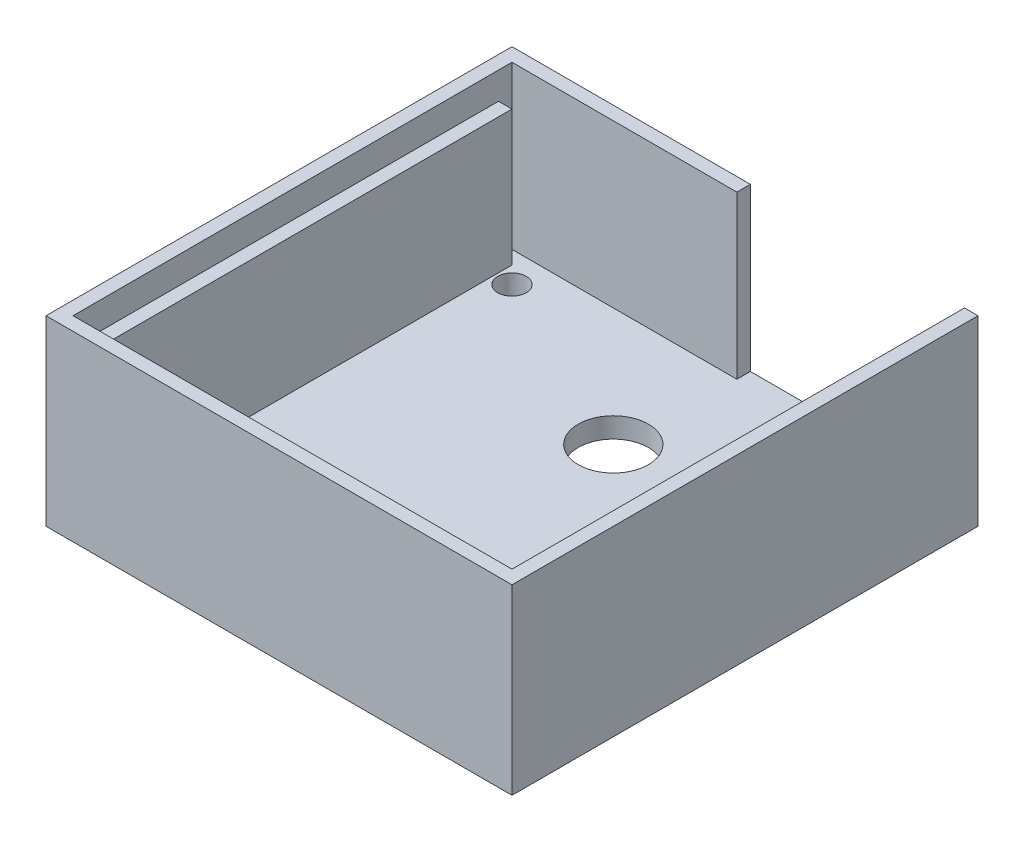
ISO-10303-21;
HEADER;
FILE_DESCRIPTION(('STEP AP214'),'2;1');
FILE_NAME('part.step','',(''),(''),'','','');
FILE_SCHEMA(('AUTOMOTIVE_DESIGN { 1 0 10303 214 1 1 1 1 }'));
ENDSEC;
DATA;
#1=APPLICATION_CONTEXT('core data for automotive mechanical design processes');
#2=APPLICATION_PROTOCOL_DEFINITION('international standard','automotive_design',2000,#1);
#3=PRODUCT_CONTEXT('',#1,'mechanical');
#4=PRODUCT('Part','Part','',(#3));
#5=PRODUCT_RELATED_PRODUCT_CATEGORY('part','',(#4));
#6=PRODUCT_DEFINITION_FORMATION('','',#4);
#7=PRODUCT_DEFINITION_CONTEXT('part definition',#1,'design');
#8=PRODUCT_DEFINITION('design','',#6,#7);
#9=PRODUCT_DEFINITION_SHAPE('','',#8);
#10=(LENGTH_UNIT() NAMED_UNIT(*) SI_UNIT(.MILLI.,.METRE.));
#11=(NAMED_UNIT(*) PLANE_ANGLE_UNIT() SI_UNIT($,.RADIAN.));
#12=(NAMED_UNIT(*) SI_UNIT($,.STERADIAN.) SOLID_ANGLE_UNIT());
#13=UNCERTAINTY_MEASURE_WITH_UNIT(LENGTH_MEASURE(1.E-05),#10,'distance_accuracy_value','');
#14=(GEOMETRIC_REPRESENTATION_CONTEXT(3) GLOBAL_UNCERTAINTY_ASSIGNED_CONTEXT((#13)) GLOBAL_UNIT_ASSIGNED_CONTEXT((#10,
#11,#12)) REPRESENTATION_CONTEXT('',''));
#15=CARTESIAN_POINT('',(0.,0.,0.));
#16=DIRECTION('',(0.,0.,1.));
#17=DIRECTION('',(1.,0.,0.));
#18=AXIS2_PLACEMENT_3D('',#15,#16,#17);
#19=CARTESIAN_POINT('',(0.,11.5,0.));
#20=DIRECTION('',(0.,1.,0.));
#21=DIRECTION('',(0.,0.,1.));
#22=AXIS2_PLACEMENT_3D('',#19,#20,#21);
#23=PLANE('',#22);
#24=DIRECTION('',(0.,0.,-1.));
#25=VECTOR('',#24,1.);
#26=CARTESIAN_POINT('',(14.5,11.5,-1.99999999999999));
#27=LINE('',#26,#25);
#28=CARTESIAN_POINT('',(14.5,11.5,-0.999999999999997));
#29=VERTEX_POINT('',#28);
#30=CARTESIAN_POINT('',(14.5,11.5,-1.99999999999999));
#31=VERTEX_POINT('',#30);
#32=EDGE_CURVE('E402',#29,#31,#27,.T.);
#33=ORIENTED_EDGE('',*,*,#32,.F.);
#34=DIRECTION('',(1.,0.,0.));
#35=VECTOR('',#34,1.);
#36=CARTESIAN_POINT('',(0.999999999999999,11.5,-0.999999999999997));
#37=LINE('',#36,#35);
#38=CARTESIAN_POINT('',(33.5,11.5,-1.));
#39=VERTEX_POINT('',#38);
#40=EDGE_CURVE('E218',#29,#39,#37,.T.);
#41=ORIENTED_EDGE('',*,*,#40,.T.);
#42=DIRECTION('',(0.,0.,-1.));
#43=VECTOR('',#42,1.);
#44=CARTESIAN_POINT('',(33.5,11.5,-1.));
#45=LINE('',#44,#43);
#46=CARTESIAN_POINT('',(33.5,11.5,-32.4840261778756));
#47=VERTEX_POINT('',#46);
#48=EDGE_CURVE('E223',#39,#47,#45,.T.);
#49=ORIENTED_EDGE('',*,*,#48,.T.);
#50=DIRECTION('',(1.,0.,0.));
#51=VECTOR('',#50,1.);
#52=CARTESIAN_POINT('',(0.,11.5,-32.4840261778756));
#53=LINE('',#52,#51);
#54=CARTESIAN_POINT('',(32.5,11.5,-32.4840261778756));
#55=VERTEX_POINT('',#54);
#56=EDGE_CURVE('E309',#55,#47,#53,.T.);
#57=ORIENTED_EDGE('',*,*,#56,.F.);
#58=DIRECTION('',(0.,0.,-1.));
#59=VECTOR('',#58,1.);
#60=CARTESIAN_POINT('',(32.5,11.5,-1.99999999999999));
#61=LINE('',#60,#59);
#62=CARTESIAN_POINT('',(32.5,11.5,-1.99999999999999));
#63=VERTEX_POINT('',#62);
#64=EDGE_CURVE('E359',#63,#55,#61,.T.);
#65=ORIENTED_EDGE('',*,*,#64,.F.);
#66=DIRECTION('',(1.,0.,0.));
#67=VECTOR('',#66,1.);
#68=CARTESIAN_POINT('',(1.99999999999998,11.5,-1.99999999999999));
#69=LINE('',#68,#67);
#70=EDGE_CURVE('E361',#31,#63,#69,.T.);
#71=ORIENTED_EDGE('',*,*,#70,.F.);
#72=EDGE_LOOP('',(#33,#41,#49,#57,#65,#71));
#73=FACE_BOUND('',#72,.T.);
#74=ADVANCED_FACE('F38',(#73),#23,.T.);
#75=CARTESIAN_POINT('',(1.99999999999998,-43.1335136523794,-1.99999999999999));
#76=DIRECTION('',(0.,0.,1.));
#77=DIRECTION('',(1.,0.,0.));
#78=AXIS2_PLACEMENT_3D('',#75,#76,#77);
#79=PLANE('',#78);
#80=DIRECTION('',(1.,0.,0.));
#81=VECTOR('',#80,1.);
#82=CARTESIAN_POINT('',(1.99999999999998,1.5,-1.99999999999999));
#83=LINE('',#82,#81);
#84=CARTESIAN_POINT('',(14.5,1.5,-1.99999999999999));
#85=VERTEX_POINT('',#84);
#86=CARTESIAN_POINT('',(32.5,1.5,-1.99999999999999));
#87=VERTEX_POINT('',#86);
#88=EDGE_CURVE('E202',#85,#87,#83,.T.);
#89=ORIENTED_EDGE('',*,*,#88,.F.);
#90=DIRECTION('',(0.,1.,0.));
#91=VECTOR('',#90,1.);
#92=CARTESIAN_POINT('',(14.5,1.5,-1.99999999999999));
#93=LINE('',#92,#91);
#94=EDGE_CURVE('E193',#85,#31,#93,.T.);
#95=ORIENTED_EDGE('',*,*,#94,.T.);
#96=ORIENTED_EDGE('',*,*,#70,.T.);
#97=DIRECTION('',(0.,1.,0.));
#98=VECTOR('',#97,1.);
#99=CARTESIAN_POINT('',(32.5,-43.1335136523794,-1.99999999999999));
#100=LINE('',#99,#98);
#101=EDGE_CURVE('E201',#87,#63,#100,.T.);
#102=ORIENTED_EDGE('',*,*,#101,.F.);
#103=EDGE_LOOP('',(#89,#95,#96,#102));
#104=FACE_BOUND('',#103,.T.);
#105=ADVANCED_FACE('F414',(#104),#79,.F.);
#106=CARTESIAN_POINT('',(0.,13.5,0.));
#107=DIRECTION('',(1.,0.,0.));
#108=DIRECTION('',(0.,0.,-1.));
#109=AXIS2_PLACEMENT_3D('',#106,#107,#108);
#110=PLANE('',#109);
#111=DIRECTION('',(0.,0.,1.));
#112=VECTOR('',#111,1.);
#113=CARTESIAN_POINT('',(0.,0.,0.));
#114=LINE('',#113,#112);
#115=CARTESIAN_POINT('',(0.,0.,-34.5));
#116=VERTEX_POINT('',#115);
#117=CARTESIAN_POINT('',(0.,0.,0.));
#118=VERTEX_POINT('',#117);
#119=EDGE_CURVE('E238',#116,#118,#114,.T.);
#120=ORIENTED_EDGE('',*,*,#119,.T.);
#121=DIRECTION('',(0.,-1.,0.));
#122=VECTOR('',#121,1.);
#123=CARTESIAN_POINT('',(0.,13.5,0.));
#124=LINE('',#123,#122);
#125=CARTESIAN_POINT('',(0.,13.5,0.));
#126=VERTEX_POINT('',#125);
#127=EDGE_CURVE('E46',#126,#118,#124,.T.);
#128=ORIENTED_EDGE('',*,*,#127,.F.);
#129=DIRECTION('',(0.,0.,1.));
#130=VECTOR('',#129,1.);
#131=CARTESIAN_POINT('',(0.,13.5,0.));
#132=LINE('',#131,#130);
#133=CARTESIAN_POINT('',(0.,13.5,-34.5));
#134=VERTEX_POINT('',#133);
#135=EDGE_CURVE('E243',#134,#126,#132,.T.);
#136=ORIENTED_EDGE('',*,*,#135,.F.);
#137=DIRECTION('',(0.,-1.,0.));
#138=VECTOR('',#137,1.);
#139=CARTESIAN_POINT('',(0.,13.5,-34.5));
#140=LINE('',#139,#138);
#141=EDGE_CURVE('E255',#134,#116,#140,.T.);
#142=ORIENTED_EDGE('',*,*,#141,.T.);
#143=EDGE_LOOP('',(#120,#128,#136,#142));
#144=FACE_BOUND('',#143,.T.);
#145=ADVANCED_FACE('F40',(#144),#110,.F.);
#146=CARTESIAN_POINT('',(0.,13.5,0.));
#147=DIRECTION('',(0.,0.,-1.));
#148=DIRECTION('',(-1.,0.,0.));
#149=AXIS2_PLACEMENT_3D('',#146,#147,#148);
#150=PLANE('',#149);
#151=DIRECTION('',(1.,0.,0.));
#152=VECTOR('',#151,1.);
#153=CARTESIAN_POINT('',(0.,0.,0.));
#154=LINE('',#153,#152);
#155=CARTESIAN_POINT('',(34.5,0.,0.));
#156=VERTEX_POINT('',#155);
#157=EDGE_CURVE('E258',#118,#156,#154,.T.);
#158=ORIENTED_EDGE('',*,*,#157,.T.);
#159=DIRECTION('',(0.,-1.,0.));
#160=VECTOR('',#159,1.);
#161=CARTESIAN_POINT('',(34.5,13.5,0.));
#162=LINE('',#161,#160);
#163=CARTESIAN_POINT('',(34.5,13.5,0.));
#164=VERTEX_POINT('',#163);
#165=EDGE_CURVE('E268',#164,#156,#162,.T.);
#166=ORIENTED_EDGE('',*,*,#165,.F.);
#167=DIRECTION('',(1.,0.,0.));
#168=VECTOR('',#167,1.);
#169=CARTESIAN_POINT('',(0.,13.5,0.));
#170=LINE('',#169,#168);
#171=EDGE_CURVE('E246',#126,#164,#170,.T.);
#172=ORIENTED_EDGE('',*,*,#171,.F.);
#173=ORIENTED_EDGE('',*,*,#127,.T.);
#174=EDGE_LOOP('',(#158,#166,#172,#173));
#175=FACE_BOUND('',#174,.T.);
#176=ADVANCED_FACE('F273',(#175),#150,.F.);
#177=CARTESIAN_POINT('',(34.5,13.5,0.));
#178=DIRECTION('',(-1.,0.,0.));
#179=DIRECTION('',(0.,0.,1.));
#180=AXIS2_PLACEMENT_3D('',#177,#178,#179);
#181=PLANE('',#180);
#182=DIRECTION('',(0.,0.,-1.));
#183=VECTOR('',#182,1.);
#184=CARTESIAN_POINT('',(34.5,0.,0.));
#185=LINE('',#184,#183);
#186=CARTESIAN_POINT('',(34.5,0.,-34.5));
#187=VERTEX_POINT('',#186);
#188=EDGE_CURVE('E260',#156,#187,#185,.T.);
#189=ORIENTED_EDGE('',*,*,#188,.T.);
#190=DIRECTION('',(0.,-1.,0.));
#191=VECTOR('',#190,1.);
#192=CARTESIAN_POINT('',(34.5,13.5,-34.5));
#193=LINE('',#192,#191);
#194=CARTESIAN_POINT('',(34.5,13.5,-34.5));
#195=VERTEX_POINT('',#194);
#196=EDGE_CURVE('E265',#195,#187,#193,.T.);
#197=ORIENTED_EDGE('',*,*,#196,.F.);
#198=DIRECTION('',(0.,0.,-1.));
#199=VECTOR('',#198,1.);
#200=CARTESIAN_POINT('',(34.5,13.5,0.));
#201=LINE('',#200,#199);
#202=EDGE_CURVE('E249',#164,#195,#201,.T.);
#203=ORIENTED_EDGE('',*,*,#202,.F.);
#204=ORIENTED_EDGE('',*,*,#165,.T.);
#205=EDGE_LOOP('',(#189,#197,#203,#204));
#206=FACE_BOUND('',#205,.T.);
#207=ADVANCED_FACE('F285',(#206),#181,.F.);
#208=CARTESIAN_POINT('',(0.,13.5,-34.5));
#209=DIRECTION('',(0.,0.,1.));
#210=DIRECTION('',(1.,0.,0.));
#211=AXIS2_PLACEMENT_3D('',#208,#209,#210);
#212=PLANE('',#211);
#213=DIRECTION('',(-1.,0.,0.));
#214=VECTOR('',#213,1.);
#215=CARTESIAN_POINT('',(17.65,1.5,-34.5));
#216=LINE('',#215,#214);
#217=CARTESIAN_POINT('',(33.5,1.5,-34.5));
#218=VERTEX_POINT('',#217);
#219=CARTESIAN_POINT('',(17.65,1.5,-34.5));
#220=VERTEX_POINT('',#219);
#221=EDGE_CURVE('E304',#218,#220,#216,.T.);
#222=ORIENTED_EDGE('',*,*,#221,.F.);
#223=DIRECTION('',(0.,1.,0.));
#224=VECTOR('',#223,1.);
#225=CARTESIAN_POINT('',(33.5,-14.4776922755287,-34.5));
#226=LINE('',#225,#224);
#227=CARTESIAN_POINT('',(33.5,13.5,-34.5));
#228=VERTEX_POINT('',#227);
#229=EDGE_CURVE('E292',#218,#228,#226,.T.);
#230=ORIENTED_EDGE('',*,*,#229,.T.);
#231=DIRECTION('',(-1.,0.,0.));
#232=VECTOR('',#231,1.);
#233=CARTESIAN_POINT('',(0.,13.5,-34.5));
#234=LINE('',#233,#232);
#235=EDGE_CURVE('E252',#195,#228,#234,.T.);
#236=ORIENTED_EDGE('',*,*,#235,.F.);
#237=ORIENTED_EDGE('',*,*,#196,.T.);
#238=DIRECTION('',(-1.,0.,0.));
#239=VECTOR('',#238,1.);
#240=CARTESIAN_POINT('',(0.,0.,-34.5));
#241=LINE('',#240,#239);
#242=EDGE_CURVE('E247',#187,#116,#241,.T.);
#243=ORIENTED_EDGE('',*,*,#242,.T.);
#244=ORIENTED_EDGE('',*,*,#141,.F.);
#245=CARTESIAN_POINT('',(17.65,13.5,-34.5));
#246=VERTEX_POINT('',#245);
#247=EDGE_CURVE('E251',#246,#134,#234,.T.);
#248=ORIENTED_EDGE('',*,*,#247,.F.);
#249=DIRECTION('',(0.,1.,0.));
#250=VECTOR('',#249,1.);
#251=CARTESIAN_POINT('',(17.65,-14.4776922755287,-34.5));
#252=LINE('',#251,#250);
#253=EDGE_CURVE('E302',#220,#246,#252,.T.);
#254=ORIENTED_EDGE('',*,*,#253,.F.);
#255=EDGE_LOOP('',(#222,#230,#236,#237,#243,#244,#248,#254));
#256=FACE_BOUND('',#255,.T.);
#257=ADVANCED_FACE('F290',(#256),#212,.F.);
#258=CARTESIAN_POINT('',(0.,13.5,0.));
#259=DIRECTION('',(0.,-1.,0.));
#260=DIRECTION('',(0.,0.,-1.));
#261=AXIS2_PLACEMENT_3D('',#258,#259,#260);
#262=PLANE('',#261);
#263=ORIENTED_EDGE('',*,*,#235,.T.);
#264=DIRECTION('',(0.,0.,-1.));
#265=VECTOR('',#264,1.);
#266=CARTESIAN_POINT('',(33.5,13.5,-1.));
#267=LINE('',#266,#265);
#268=CARTESIAN_POINT('',(33.5,13.5,-1.));
#269=VERTEX_POINT('',#268);
#270=EDGE_CURVE('E219',#269,#228,#267,.T.);
#271=ORIENTED_EDGE('',*,*,#270,.F.);
#272=DIRECTION('',(1.,0.,0.));
#273=VECTOR('',#272,1.);
#274=CARTESIAN_POINT('',(0.999999999999999,13.5,-0.999999999999997));
#275=LINE('',#274,#273);
#276=CARTESIAN_POINT('',(0.999999999999999,13.5,-0.999999999999997));
#277=VERTEX_POINT('',#276);
#278=EDGE_CURVE('E232',#277,#269,#275,.T.);
#279=ORIENTED_EDGE('',*,*,#278,.F.);
#280=DIRECTION('',(0.,0.,1.));
#281=VECTOR('',#280,1.);
#282=CARTESIAN_POINT('',(0.999999999999997,13.5,-33.5));
#283=LINE('',#282,#281);
#284=CARTESIAN_POINT('',(0.999999999999997,13.5,-33.5));
#285=VERTEX_POINT('',#284);
#286=EDGE_CURVE('E229',#285,#277,#283,.T.);
#287=ORIENTED_EDGE('',*,*,#286,.F.);
#288=DIRECTION('',(-1.,0.,0.));
#289=VECTOR('',#288,1.);
#290=CARTESIAN_POINT('',(33.5,13.5,-33.5));
#291=LINE('',#290,#289);
#292=CARTESIAN_POINT('',(17.65,13.5,-33.5));
#293=VERTEX_POINT('',#292);
#294=EDGE_CURVE('E227',#293,#285,#291,.T.);
#295=ORIENTED_EDGE('',*,*,#294,.F.);
#296=DIRECTION('',(0.,0.,1.));
#297=VECTOR('',#296,1.);
#298=CARTESIAN_POINT('',(17.65,13.5,-34.5));
#299=LINE('',#298,#297);
#300=EDGE_CURVE('E300',#246,#293,#299,.T.);
#301=ORIENTED_EDGE('',*,*,#300,.F.);
#302=ORIENTED_EDGE('',*,*,#247,.T.);
#303=ORIENTED_EDGE('',*,*,#135,.T.);
#304=ORIENTED_EDGE('',*,*,#171,.T.);
#305=ORIENTED_EDGE('',*,*,#202,.T.);
#306=EDGE_LOOP('',(#263,#271,#279,#287,#295,#301,#302,#303,#304,#305));
#307=FACE_BOUND('',#306,.T.);
#308=ADVANCED_FACE('F295',(#307),#262,.F.);
#309=CARTESIAN_POINT('',(0.,0.,0.));
#310=DIRECTION('',(0.,-1.,0.));
#311=DIRECTION('',(0.,0.,-1.));
#312=AXIS2_PLACEMENT_3D('',#309,#310,#311);
#313=PLANE('',#312);
#314=CARTESIAN_POINT('',(31.25,0.,-31.25));
#315=DIRECTION('',(0.,-1.,0.));
#316=DIRECTION('',(0.,0.,-1.));
#317=AXIS2_PLACEMENT_3D('',#314,#315,#316);
#318=CIRCLE('',#317,1.0552593244145);
#319=CARTESIAN_POINT('',(31.25,0.,-32.3052593244145));
#320=VERTEX_POINT('',#319);
#321=EDGE_CURVE('E356',#320,#320,#318,.T.);
#322=ORIENTED_EDGE('',*,*,#321,.F.);
#323=EDGE_LOOP('',(#322));
#324=FACE_BOUND('',#323,.T.);
#325=CARTESIAN_POINT('',(31.25,0.,-3.24999999999999));
#326=DIRECTION('',(0.,-1.,0.));
#327=DIRECTION('',(0.,0.,-1.));
#328=AXIS2_PLACEMENT_3D('',#325,#326,#327);
#329=CIRCLE('',#328,1.0552593244145);
#330=CARTESIAN_POINT('',(31.25,0.,-4.30525932441449));
#331=VERTEX_POINT('',#330);
#332=EDGE_CURVE('E353',#331,#331,#329,.T.);
#333=ORIENTED_EDGE('',*,*,#332,.F.);
#334=EDGE_LOOP('',(#333));
#335=FACE_BOUND('',#334,.T.);
#336=CARTESIAN_POINT('',(3.24999999999999,0.,-3.25));
#337=DIRECTION('',(0.,-1.,0.));
#338=DIRECTION('',(0.,0.,-1.));
#339=AXIS2_PLACEMENT_3D('',#336,#337,#338);
#340=CIRCLE('',#339,1.0552593244145);
#341=CARTESIAN_POINT('',(3.24999999999999,0.,-4.30525932441449));
#342=VERTEX_POINT('',#341);
#343=EDGE_CURVE('E350',#342,#342,#340,.T.);
#344=ORIENTED_EDGE('',*,*,#343,.F.);
#345=EDGE_LOOP('',(#344));
#346=FACE_BOUND('',#345,.T.);
#347=CARTESIAN_POINT('',(17.25,0.,-24.75));
#348=DIRECTION('',(0.,-1.,0.));
#349=DIRECTION('',(0.,0.,-1.));
#350=AXIS2_PLACEMENT_3D('',#347,#348,#349);
#351=CIRCLE('',#350,2.6);
#352=CARTESIAN_POINT('',(17.25,0.,-27.35));
#353=VERTEX_POINT('',#352);
#354=EDGE_CURVE('E347',#353,#353,#351,.T.);
#355=ORIENTED_EDGE('',*,*,#354,.F.);
#356=EDGE_LOOP('',(#355));
#357=FACE_BOUND('',#356,.T.);
#358=CARTESIAN_POINT('',(17.25,0.,-9.74999999999999));
#359=DIRECTION('',(0.,-1.,0.));
#360=DIRECTION('',(0.,0.,-1.));
#361=AXIS2_PLACEMENT_3D('',#358,#359,#360);
#362=CIRCLE('',#361,2.59999999999999);
#363=CARTESIAN_POINT('',(17.25,0.,-12.35));
#364=VERTEX_POINT('',#363);
#365=EDGE_CURVE('E344',#364,#364,#362,.T.);
#366=ORIENTED_EDGE('',*,*,#365,.F.);
#367=EDGE_LOOP('',(#366));
#368=FACE_BOUND('',#367,.T.);
#369=CARTESIAN_POINT('',(3.24999999999999,0.,-31.25));
#370=DIRECTION('',(0.,-1.,0.));
#371=DIRECTION('',(0.,0.,-1.));
#372=AXIS2_PLACEMENT_3D('',#369,#370,#371);
#373=CIRCLE('',#372,1.0552593244145);
#374=CARTESIAN_POINT('',(3.24999999999999,0.,-32.3052593244145));
#375=VERTEX_POINT('',#374);
#376=EDGE_CURVE('E341',#375,#375,#373,.T.);
#377=ORIENTED_EDGE('',*,*,#376,.F.);
#378=EDGE_LOOP('',(#377));
#379=FACE_BOUND('',#378,.T.);
#380=ORIENTED_EDGE('',*,*,#119,.F.);
#381=ORIENTED_EDGE('',*,*,#242,.F.);
#382=ORIENTED_EDGE('',*,*,#188,.F.);
#383=ORIENTED_EDGE('',*,*,#157,.F.);
#384=EDGE_LOOP('',(#380,#381,#382,#383));
#385=FACE_BOUND('',#384,.T.);
#386=ADVANCED_FACE('F281',(#324,#335,#346,#357,#368,#379,#385),#313,.T.);
#387=CARTESIAN_POINT('',(33.5,11.5,-33.5));
#388=DIRECTION('',(0.,0.,-1.));
#389=DIRECTION('',(-1.,0.,0.));
#390=AXIS2_PLACEMENT_3D('',#387,#388,#389);
#391=PLANE('',#390);
#392=DIRECTION('',(0.,1.,0.));
#393=VECTOR('',#392,1.);
#394=CARTESIAN_POINT('',(0.999999999999997,11.5,-33.5));
#395=LINE('',#394,#393);
#396=CARTESIAN_POINT('',(0.999999999999997,1.5,-33.5));
#397=VERTEX_POINT('',#396);
#398=EDGE_CURVE('E226',#397,#285,#395,.T.);
#399=ORIENTED_EDGE('',*,*,#398,.F.);
#400=DIRECTION('',(-1.,0.,0.));
#401=VECTOR('',#400,1.);
#402=CARTESIAN_POINT('',(17.65,1.5,-33.5));
#403=LINE('',#402,#401);
#404=CARTESIAN_POINT('',(17.65,1.5,-33.5));
#405=VERTEX_POINT('',#404);
#406=EDGE_CURVE('E388',#405,#397,#403,.T.);
#407=ORIENTED_EDGE('',*,*,#406,.F.);
#408=DIRECTION('',(0.,1.,0.));
#409=VECTOR('',#408,1.);
#410=CARTESIAN_POINT('',(17.65,11.5,-33.5));
#411=LINE('',#410,#409);
#412=EDGE_CURVE('E320',#405,#293,#411,.T.);
#413=ORIENTED_EDGE('',*,*,#412,.T.);
#414=ORIENTED_EDGE('',*,*,#294,.T.);
#415=EDGE_LOOP('',(#399,#407,#413,#414));
#416=FACE_BOUND('',#415,.T.);
#417=ADVANCED_FACE('F443',(#416),#391,.F.);
#418=CARTESIAN_POINT('',(33.5,11.5,-1.));
#419=DIRECTION('',(1.,0.,0.));
#420=DIRECTION('',(0.,0.,-1.));
#421=AXIS2_PLACEMENT_3D('',#418,#419,#420);
#422=PLANE('',#421);
#423=ORIENTED_EDGE('',*,*,#270,.T.);
#424=ORIENTED_EDGE('',*,*,#229,.F.);
#425=DIRECTION('',(0.,0.,-1.));
#426=VECTOR('',#425,1.);
#427=CARTESIAN_POINT('',(33.5,1.5,-34.5));
#428=LINE('',#427,#426);
#429=CARTESIAN_POINT('',(33.5,1.5,-32.4840261778756));
#430=VERTEX_POINT('',#429);
#431=EDGE_CURVE('E314',#430,#218,#428,.T.);
#432=ORIENTED_EDGE('',*,*,#431,.F.);
#433=DIRECTION('',(0.,1.,0.));
#434=VECTOR('',#433,1.);
#435=CARTESIAN_POINT('',(33.5,-14.4776922755287,-32.4840261778756));
#436=LINE('',#435,#434);
#437=EDGE_CURVE('E316',#430,#47,#436,.T.);
#438=ORIENTED_EDGE('',*,*,#437,.T.);
#439=ORIENTED_EDGE('',*,*,#48,.F.);
#440=DIRECTION('',(0.,1.,0.));
#441=VECTOR('',#440,1.);
#442=CARTESIAN_POINT('',(33.5,11.5,-1.));
#443=LINE('',#442,#441);
#444=EDGE_CURVE('E236',#39,#269,#443,.T.);
#445=ORIENTED_EDGE('',*,*,#444,.T.);
#446=EDGE_LOOP('',(#423,#424,#432,#438,#439,#445));
#447=FACE_BOUND('',#446,.T.);
#448=ADVANCED_FACE('F378',(#447),#422,.F.);
#449=CARTESIAN_POINT('',(0.999999999999999,11.5,-0.999999999999997));
#450=DIRECTION('',(0.,0.,1.));
#451=DIRECTION('',(1.,0.,0.));
#452=AXIS2_PLACEMENT_3D('',#449,#450,#451);
#453=PLANE('',#452);
#454=ORIENTED_EDGE('',*,*,#278,.T.);
#455=ORIENTED_EDGE('',*,*,#444,.F.);
#456=ORIENTED_EDGE('',*,*,#40,.F.);
#457=DIRECTION('',(0.,1.,0.));
#458=VECTOR('',#457,1.);
#459=CARTESIAN_POINT('',(14.5,1.5,-0.999999999999997));
#460=LINE('',#459,#458);
#461=CARTESIAN_POINT('',(14.5,1.5,-0.999999999999997));
#462=VERTEX_POINT('',#461);
#463=EDGE_CURVE('E389',#462,#29,#460,.T.);
#464=ORIENTED_EDGE('',*,*,#463,.F.);
#465=DIRECTION('',(1.,0.,0.));
#466=VECTOR('',#465,1.);
#467=CARTESIAN_POINT('',(14.5,1.5,-0.999999999999997));
#468=LINE('',#467,#466);
#469=CARTESIAN_POINT('',(5.,1.5,-0.999999999999997));
#470=VERTEX_POINT('',#469);
#471=EDGE_CURVE('E183',#470,#462,#468,.T.);
#472=ORIENTED_EDGE('',*,*,#471,.F.);
#473=DIRECTION('',(0.,1.,0.));
#474=VECTOR('',#473,1.);
#475=CARTESIAN_POINT('',(5.,1.5,-0.999999999999997));
#476=LINE('',#475,#474);
#477=CARTESIAN_POINT('',(5.,11.5,-0.999999999999997));
#478=VERTEX_POINT('',#477);
#479=EDGE_CURVE('E180',#470,#478,#476,.T.);
#480=ORIENTED_EDGE('',*,*,#479,.T.);
#481=CARTESIAN_POINT('',(0.999999999999999,11.5,-0.999999999999997));
#482=VERTEX_POINT('',#481);
#483=EDGE_CURVE('E220',#482,#478,#37,.T.);
#484=ORIENTED_EDGE('',*,*,#483,.F.);
#485=DIRECTION('',(0.,1.,0.));
#486=VECTOR('',#485,1.);
#487=CARTESIAN_POINT('',(0.999999999999999,11.5,-0.999999999999997));
#488=LINE('',#487,#486);
#489=EDGE_CURVE('E239',#482,#277,#488,.T.);
#490=ORIENTED_EDGE('',*,*,#489,.T.);
#491=EDGE_LOOP('',(#454,#455,#456,#464,#472,#480,#484,#490));
#492=FACE_BOUND('',#491,.T.);
#493=ADVANCED_FACE('F406',(#492),#453,.F.);
#494=CARTESIAN_POINT('',(0.999999999999997,11.5,-33.5));
#495=DIRECTION('',(-1.,0.,0.));
#496=DIRECTION('',(0.,0.,1.));
#497=AXIS2_PLACEMENT_3D('',#494,#495,#496);
#498=PLANE('',#497);
#499=ORIENTED_EDGE('',*,*,#286,.T.);
#500=ORIENTED_EDGE('',*,*,#489,.F.);
#501=DIRECTION('',(0.,0.,1.));
#502=VECTOR('',#501,1.);
#503=CARTESIAN_POINT('',(0.999999999999997,11.5,-33.5));
#504=LINE('',#503,#502);
#505=CARTESIAN_POINT('',(0.999999999999997,11.5,-32.5));
#506=VERTEX_POINT('',#505);
#507=EDGE_CURVE('E216',#506,#482,#504,.T.);
#508=ORIENTED_EDGE('',*,*,#507,.F.);
#509=DIRECTION('',(0.,1.,0.));
#510=VECTOR('',#509,1.);
#511=CARTESIAN_POINT('',(0.999999999999997,1.5,-32.5));
#512=LINE('',#511,#510);
#513=CARTESIAN_POINT('',(0.999999999999997,1.5,-32.5));
#514=VERTEX_POINT('',#513);
#515=EDGE_CURVE('E381',#514,#506,#512,.T.);
#516=ORIENTED_EDGE('',*,*,#515,.F.);
#517=DIRECTION('',(0.,0.,1.));
#518=VECTOR('',#517,1.);
#519=CARTESIAN_POINT('',(0.999999999999997,1.5,-32.5));
#520=LINE('',#519,#518);
#521=EDGE_CURVE('E391',#397,#514,#520,.T.);
#522=ORIENTED_EDGE('',*,*,#521,.F.);
#523=ORIENTED_EDGE('',*,*,#398,.T.);
#524=EDGE_LOOP('',(#499,#500,#508,#516,#522,#523));
#525=FACE_BOUND('',#524,.T.);
#526=ADVANCED_FACE('F439',(#525),#498,.F.);
#527=DIRECTION('',(0.,0.,1.));
#528=VECTOR('',#527,1.);
#529=CARTESIAN_POINT('',(5.,11.5,-1.99999999999999));
#530=LINE('',#529,#528);
#531=CARTESIAN_POINT('',(5.,11.5,-1.99999999999999));
#532=VERTEX_POINT('',#531);
#533=EDGE_CURVE('E400',#532,#478,#530,.T.);
#534=ORIENTED_EDGE('',*,*,#533,.F.);
#535=CARTESIAN_POINT('',(1.99999999999998,11.5,-1.99999999999999));
#536=VERTEX_POINT('',#535);
#537=EDGE_CURVE('E192',#536,#532,#69,.T.);
#538=ORIENTED_EDGE('',*,*,#537,.F.);
#539=DIRECTION('',(0.,0.,1.));
#540=VECTOR('',#539,1.);
#541=CARTESIAN_POINT('',(1.99999999999998,11.5,-1.99999999999999));
#542=LINE('',#541,#540);
#543=CARTESIAN_POINT('',(1.99999999999998,11.5,-32.5));
#544=VERTEX_POINT('',#543);
#545=EDGE_CURVE('E362',#544,#536,#542,.T.);
#546=ORIENTED_EDGE('',*,*,#545,.F.);
#547=DIRECTION('',(1.,0.,0.));
#548=VECTOR('',#547,1.);
#549=CARTESIAN_POINT('',(17.65,11.5,-32.5));
#550=LINE('',#549,#548);
#551=EDGE_CURVE('E386',#506,#544,#550,.T.);
#552=ORIENTED_EDGE('',*,*,#551,.F.);
#553=ORIENTED_EDGE('',*,*,#507,.T.);
#554=ORIENTED_EDGE('',*,*,#483,.T.);
#555=EDGE_LOOP('',(#534,#538,#546,#552,#553,#554));
#556=FACE_BOUND('',#555,.T.);
#557=ADVANCED_FACE('F422',(#556),#23,.T.);
#558=CARTESIAN_POINT('',(0.,1.5,0.));
#559=DIRECTION('',(0.,-1.,0.));
#560=DIRECTION('',(0.,0.,-1.));
#561=AXIS2_PLACEMENT_3D('',#558,#559,#560);
#562=PLANE('',#561);
#563=DIRECTION('',(1.,0.,0.));
#564=VECTOR('',#563,1.);
#565=CARTESIAN_POINT('',(17.65,1.5,-32.5));
#566=LINE('',#565,#564);
#567=CARTESIAN_POINT('',(1.99999999999998,1.5,-32.5));
#568=VERTEX_POINT('',#567);
#569=EDGE_CURVE('E385',#514,#568,#566,.T.);
#570=ORIENTED_EDGE('',*,*,#569,.T.);
#571=DIRECTION('',(0.,0.,1.));
#572=VECTOR('',#571,1.);
#573=CARTESIAN_POINT('',(1.99999999999998,1.5,-1.99999999999999));
#574=LINE('',#573,#572);
#575=CARTESIAN_POINT('',(1.99999999999998,1.5,-1.99999999999999));
#576=VERTEX_POINT('',#575);
#577=EDGE_CURVE('E200',#568,#576,#574,.T.);
#578=ORIENTED_EDGE('',*,*,#577,.T.);
#579=CARTESIAN_POINT('',(5.,1.5,-1.99999999999999));
#580=VERTEX_POINT('',#579);
#581=EDGE_CURVE('E189',#576,#580,#83,.T.);
#582=ORIENTED_EDGE('',*,*,#581,.T.);
#583=DIRECTION('',(0.,0.,1.));
#584=VECTOR('',#583,1.);
#585=CARTESIAN_POINT('',(5.,1.5,-1.99999999999999));
#586=LINE('',#585,#584);
#587=EDGE_CURVE('E174',#580,#470,#586,.T.);
#588=ORIENTED_EDGE('',*,*,#587,.T.);
#589=ORIENTED_EDGE('',*,*,#471,.T.);
#590=DIRECTION('',(0.,0.,-1.));
#591=VECTOR('',#590,1.);
#592=CARTESIAN_POINT('',(14.5,1.5,-1.99999999999999));
#593=LINE('',#592,#591);
#594=EDGE_CURVE('E53',#462,#85,#593,.T.);
#595=ORIENTED_EDGE('',*,*,#594,.T.);
#596=ORIENTED_EDGE('',*,*,#88,.T.);
#597=DIRECTION('',(0.,0.,-1.));
#598=VECTOR('',#597,1.);
#599=CARTESIAN_POINT('',(32.5,1.5,-1.99999999999999));
#600=LINE('',#599,#598);
#601=CARTESIAN_POINT('',(32.5,1.5,-32.4840261778756));
#602=VERTEX_POINT('',#601);
#603=EDGE_CURVE('E205',#87,#602,#600,.T.);
#604=ORIENTED_EDGE('',*,*,#603,.T.);
#605=DIRECTION('',(1.,0.,0.));
#606=VECTOR('',#605,1.);
#607=CARTESIAN_POINT('',(17.65,1.5,-32.4840261778756));
#608=LINE('',#607,#606);
#609=EDGE_CURVE('E61',#602,#430,#608,.T.);
#610=ORIENTED_EDGE('',*,*,#609,.T.);
#611=ORIENTED_EDGE('',*,*,#431,.T.);
#612=ORIENTED_EDGE('',*,*,#221,.T.);
#613=DIRECTION('',(0.,0.,1.));
#614=VECTOR('',#613,1.);
#615=CARTESIAN_POINT('',(17.65,1.5,-34.5));
#616=LINE('',#615,#614);
#617=EDGE_CURVE('E306',#220,#405,#616,.T.);
#618=ORIENTED_EDGE('',*,*,#617,.T.);
#619=ORIENTED_EDGE('',*,*,#406,.T.);
#620=ORIENTED_EDGE('',*,*,#521,.T.);
#621=EDGE_LOOP('',(#570,#578,#582,#588,#589,#595,#596,#604,#610,#611,#612,#618,#619,#620));
#622=FACE_BOUND('',#621,.T.);
#623=CARTESIAN_POINT('',(31.25,1.5,-31.25));
#624=DIRECTION('',(0.,1.,0.));
#625=DIRECTION('',(0.,0.,-1.));
#626=AXIS2_PLACEMENT_3D('',#623,#624,#625);
#627=CIRCLE('',#626,1.0552593244145);
#628=CARTESIAN_POINT('',(31.25,1.5,-32.3052593244145));
#629=VERTEX_POINT('',#628);
#630=EDGE_CURVE('E327',#629,#629,#627,.T.);
#631=ORIENTED_EDGE('',*,*,#630,.F.);
#632=EDGE_LOOP('',(#631));
#633=FACE_BOUND('',#632,.T.);
#634=CARTESIAN_POINT('',(31.25,1.5,-3.24999999999999));
#635=DIRECTION('',(0.,1.,0.));
#636=DIRECTION('',(0.,0.,1.));
#637=AXIS2_PLACEMENT_3D('',#634,#635,#636);
#638=CIRCLE('',#637,1.0552593244145);
#639=CARTESIAN_POINT('',(31.25,1.5,-2.19474067558549));
#640=VERTEX_POINT('',#639);
#641=EDGE_CURVE('E331',#640,#640,#638,.T.);
#642=ORIENTED_EDGE('',*,*,#641,.F.);
#643=EDGE_LOOP('',(#642));
#644=FACE_BOUND('',#643,.T.);
#645=CARTESIAN_POINT('',(3.24999999999999,1.5,-3.25));
#646=DIRECTION('',(0.,1.,0.));
#647=DIRECTION('',(0.,0.,-1.));
#648=AXIS2_PLACEMENT_3D('',#645,#646,#647);
#649=CIRCLE('',#648,1.0552593244145);
#650=CARTESIAN_POINT('',(3.24999999999999,1.5,-4.30525932441449));
#651=VERTEX_POINT('',#650);
#652=EDGE_CURVE('E334',#651,#651,#649,.T.);
#653=ORIENTED_EDGE('',*,*,#652,.F.);
#654=EDGE_LOOP('',(#653));
#655=FACE_BOUND('',#654,.T.);
#656=CARTESIAN_POINT('',(17.25,1.5,-24.75));
#657=DIRECTION('',(0.,1.,0.));
#658=DIRECTION('',(0.,0.,1.));
#659=AXIS2_PLACEMENT_3D('',#656,#657,#658);
#660=CIRCLE('',#659,2.6);
#661=CARTESIAN_POINT('',(17.25,1.5,-22.15));
#662=VERTEX_POINT('',#661);
#663=EDGE_CURVE('E326',#662,#662,#660,.T.);
#664=ORIENTED_EDGE('',*,*,#663,.F.);
#665=EDGE_LOOP('',(#664));
#666=FACE_BOUND('',#665,.T.);
#667=CARTESIAN_POINT('',(17.25,1.5,-9.74999999999999));
#668=DIRECTION('',(0.,1.,0.));
#669=DIRECTION('',(0.,0.,-1.));
#670=AXIS2_PLACEMENT_3D('',#667,#668,#669);
#671=CIRCLE('',#670,2.59999999999999);
#672=CARTESIAN_POINT('',(17.25,1.5,-12.35));
#673=VERTEX_POINT('',#672);
#674=EDGE_CURVE('E323',#673,#673,#671,.T.);
#675=ORIENTED_EDGE('',*,*,#674,.F.);
#676=EDGE_LOOP('',(#675));
#677=FACE_BOUND('',#676,.T.);
#678=CARTESIAN_POINT('',(3.24999999999999,1.5,-31.25));
#679=DIRECTION('',(0.,1.,0.));
#680=DIRECTION('',(0.,0.,1.));
#681=AXIS2_PLACEMENT_3D('',#678,#679,#680);
#682=CIRCLE('',#681,1.0552593244145);
#683=CARTESIAN_POINT('',(3.24999999999999,1.5,-30.1947406755855));
#684=VERTEX_POINT('',#683);
#685=EDGE_CURVE('E330',#684,#684,#682,.T.);
#686=ORIENTED_EDGE('',*,*,#685,.F.);
#687=EDGE_LOOP('',(#686));
#688=FACE_BOUND('',#687,.T.);
#689=ADVANCED_FACE('F197',(#622,#633,#644,#655,#666,#677,#688),#562,.F.);
#690=CARTESIAN_POINT('',(1.99999999999998,-43.1335136523794,-1.99999999999999));
#691=DIRECTION('',(-1.,0.,0.));
#692=DIRECTION('',(0.,0.,1.));
#693=AXIS2_PLACEMENT_3D('',#690,#691,#692);
#694=PLANE('',#693);
#695=DIRECTION('',(0.,1.,0.));
#696=VECTOR('',#695,1.);
#697=CARTESIAN_POINT('',(1.99999999999998,-43.1335136523794,-32.5));
#698=LINE('',#697,#696);
#699=EDGE_CURVE('E211',#568,#544,#698,.T.);
#700=ORIENTED_EDGE('',*,*,#699,.T.);
#701=ORIENTED_EDGE('',*,*,#545,.T.);
#702=DIRECTION('',(0.,1.,0.));
#703=VECTOR('',#702,1.);
#704=CARTESIAN_POINT('',(1.99999999999998,-43.1335136523794,-1.99999999999999));
#705=LINE('',#704,#703);
#706=EDGE_CURVE('E207',#576,#536,#705,.T.);
#707=ORIENTED_EDGE('',*,*,#706,.F.);
#708=ORIENTED_EDGE('',*,*,#577,.F.);
#709=EDGE_LOOP('',(#700,#701,#707,#708));
#710=FACE_BOUND('',#709,.T.);
#711=ADVANCED_FACE('F426',(#710),#694,.F.);
#712=ORIENTED_EDGE('',*,*,#537,.T.);
#713=DIRECTION('',(0.,1.,0.));
#714=VECTOR('',#713,1.);
#715=CARTESIAN_POINT('',(5.,1.5,-1.99999999999999));
#716=LINE('',#715,#714);
#717=EDGE_CURVE('E178',#580,#532,#716,.T.);
#718=ORIENTED_EDGE('',*,*,#717,.F.);
#719=ORIENTED_EDGE('',*,*,#581,.F.);
#720=ORIENTED_EDGE('',*,*,#706,.T.);
#721=EDGE_LOOP('',(#712,#718,#719,#720));
#722=FACE_BOUND('',#721,.T.);
#723=ADVANCED_FACE('F187',(#722),#79,.F.);
#724=CARTESIAN_POINT('',(32.5,-43.1335136523794,-1.99999999999999));
#725=DIRECTION('',(1.,0.,0.));
#726=DIRECTION('',(0.,0.,-1.));
#727=AXIS2_PLACEMENT_3D('',#724,#725,#726);
#728=PLANE('',#727);
#729=ORIENTED_EDGE('',*,*,#64,.T.);
#730=DIRECTION('',(0.,-1.,0.));
#731=VECTOR('',#730,1.);
#732=CARTESIAN_POINT('',(32.5,-43.1335136523794,-32.4840261778756));
#733=LINE('',#732,#731);
#734=EDGE_CURVE('E12',#55,#602,#733,.T.);
#735=ORIENTED_EDGE('',*,*,#734,.T.);
#736=ORIENTED_EDGE('',*,*,#603,.F.);
#737=ORIENTED_EDGE('',*,*,#101,.T.);
#738=EDGE_LOOP('',(#729,#735,#736,#737));
#739=FACE_BOUND('',#738,.T.);
#740=ADVANCED_FACE('F366',(#739),#728,.F.);
#741=CARTESIAN_POINT('',(3.24999999999999,-10.5,-31.25));
#742=DIRECTION('',(0.,1.,0.));
#743=DIRECTION('',(0.,0.,1.));
#744=AXIS2_PLACEMENT_3D('',#741,#742,#743);
#745=CYLINDRICAL_SURFACE('',#744,1.0552593244145);
#746=ORIENTED_EDGE('',*,*,#376,.T.);
#747=EDGE_LOOP('',(#746));
#748=FACE_BOUND('',#747,.T.);
#749=ORIENTED_EDGE('',*,*,#685,.T.);
#750=EDGE_LOOP('',(#749));
#751=FACE_BOUND('',#750,.T.);
#752=ADVANCED_FACE('F431',(#748,#751),#745,.F.);
#753=CARTESIAN_POINT('',(17.25,-10.5,-9.74999999999999));
#754=DIRECTION('',(0.,1.,0.));
#755=DIRECTION('',(0.,0.,1.));
#756=AXIS2_PLACEMENT_3D('',#753,#754,#755);
#757=CYLINDRICAL_SURFACE('',#756,2.59999999999999);
#758=ORIENTED_EDGE('',*,*,#365,.T.);
#759=EDGE_LOOP('',(#758));
#760=FACE_BOUND('',#759,.T.);
#761=ORIENTED_EDGE('',*,*,#674,.T.);
#762=EDGE_LOOP('',(#761));
#763=FACE_BOUND('',#762,.T.);
#764=ADVANCED_FACE('F547',(#760,#763),#757,.F.);
#765=CARTESIAN_POINT('',(17.25,-10.5,-24.75));
#766=DIRECTION('',(0.,1.,0.));
#767=DIRECTION('',(0.,0.,1.));
#768=AXIS2_PLACEMENT_3D('',#765,#766,#767);
#769=CYLINDRICAL_SURFACE('',#768,2.6);
#770=ORIENTED_EDGE('',*,*,#354,.T.);
#771=EDGE_LOOP('',(#770));
#772=FACE_BOUND('',#771,.T.);
#773=ORIENTED_EDGE('',*,*,#663,.T.);
#774=EDGE_LOOP('',(#773));
#775=FACE_BOUND('',#774,.T.);
#776=ADVANCED_FACE('F550',(#772,#775),#769,.F.);
#777=CARTESIAN_POINT('',(3.24999999999999,-10.5,-3.25));
#778=DIRECTION('',(0.,1.,0.));
#779=DIRECTION('',(0.,0.,1.));
#780=AXIS2_PLACEMENT_3D('',#777,#778,#779);
#781=CYLINDRICAL_SURFACE('',#780,1.0552593244145);
#782=ORIENTED_EDGE('',*,*,#343,.T.);
#783=EDGE_LOOP('',(#782));
#784=FACE_BOUND('',#783,.T.);
#785=ORIENTED_EDGE('',*,*,#652,.T.);
#786=EDGE_LOOP('',(#785));
#787=FACE_BOUND('',#786,.T.);
#788=ADVANCED_FACE('F558',(#784,#787),#781,.F.);
#789=CARTESIAN_POINT('',(31.25,-10.5,-3.24999999999999));
#790=DIRECTION('',(0.,1.,0.));
#791=DIRECTION('',(0.,0.,1.));
#792=AXIS2_PLACEMENT_3D('',#789,#790,#791);
#793=CYLINDRICAL_SURFACE('',#792,1.0552593244145);
#794=ORIENTED_EDGE('',*,*,#332,.T.);
#795=EDGE_LOOP('',(#794));
#796=FACE_BOUND('',#795,.T.);
#797=ORIENTED_EDGE('',*,*,#641,.T.);
#798=EDGE_LOOP('',(#797));
#799=FACE_BOUND('',#798,.T.);
#800=ADVANCED_FACE('F554',(#796,#799),#793,.F.);
#801=CARTESIAN_POINT('',(31.25,-10.5,-31.25));
#802=DIRECTION('',(0.,1.,0.));
#803=DIRECTION('',(0.,0.,1.));
#804=AXIS2_PLACEMENT_3D('',#801,#802,#803);
#805=CYLINDRICAL_SURFACE('',#804,1.0552593244145);
#806=ORIENTED_EDGE('',*,*,#321,.T.);
#807=EDGE_LOOP('',(#806));
#808=FACE_BOUND('',#807,.T.);
#809=ORIENTED_EDGE('',*,*,#630,.T.);
#810=EDGE_LOOP('',(#809));
#811=FACE_BOUND('',#810,.T.);
#812=ADVANCED_FACE('F544',(#808,#811),#805,.F.);
#813=CARTESIAN_POINT('',(17.65,-14.4776922755287,-34.5));
#814=DIRECTION('',(-1.,0.,0.));
#815=DIRECTION('',(0.,0.,1.));
#816=AXIS2_PLACEMENT_3D('',#813,#814,#815);
#817=PLANE('',#816);
#818=ORIENTED_EDGE('',*,*,#412,.F.);
#819=ORIENTED_EDGE('',*,*,#617,.F.);
#820=ORIENTED_EDGE('',*,*,#253,.T.);
#821=ORIENTED_EDGE('',*,*,#300,.T.);
#822=EDGE_LOOP('',(#818,#819,#820,#821));
#823=FACE_BOUND('',#822,.T.);
#824=ADVANCED_FACE('F541',(#823),#817,.F.);
#825=CARTESIAN_POINT('',(17.65,-14.4776922755287,-32.4840261778756));
#826=DIRECTION('',(0.,0.,1.));
#827=DIRECTION('',(1.,0.,0.));
#828=AXIS2_PLACEMENT_3D('',#825,#826,#827);
#829=PLANE('',#828);
#830=ORIENTED_EDGE('',*,*,#56,.T.);
#831=ORIENTED_EDGE('',*,*,#437,.F.);
#832=ORIENTED_EDGE('',*,*,#609,.F.);
#833=ORIENTED_EDGE('',*,*,#734,.F.);
#834=EDGE_LOOP('',(#830,#831,#832,#833));
#835=FACE_BOUND('',#834,.T.);
#836=ADVANCED_FACE('F375',(#835),#829,.F.);
#837=CARTESIAN_POINT('',(17.65,1.5,-32.5));
#838=DIRECTION('',(0.,0.,1.));
#839=DIRECTION('',(1.,0.,0.));
#840=AXIS2_PLACEMENT_3D('',#837,#838,#839);
#841=PLANE('',#840);
#842=ORIENTED_EDGE('',*,*,#569,.F.);
#843=ORIENTED_EDGE('',*,*,#515,.T.);
#844=ORIENTED_EDGE('',*,*,#551,.T.);
#845=ORIENTED_EDGE('',*,*,#699,.F.);
#846=EDGE_LOOP('',(#842,#843,#844,#845));
#847=FACE_BOUND('',#846,.T.);
#848=ADVANCED_FACE('F525',(#847),#841,.F.);
#849=CARTESIAN_POINT('',(14.5,1.5,-1.99999999999999));
#850=DIRECTION('',(1.,0.,0.));
#851=DIRECTION('',(0.,0.,-1.));
#852=AXIS2_PLACEMENT_3D('',#849,#850,#851);
#853=PLANE('',#852);
#854=ORIENTED_EDGE('',*,*,#32,.T.);
#855=ORIENTED_EDGE('',*,*,#94,.F.);
#856=ORIENTED_EDGE('',*,*,#594,.F.);
#857=ORIENTED_EDGE('',*,*,#463,.T.);
#858=EDGE_LOOP('',(#854,#855,#856,#857));
#859=FACE_BOUND('',#858,.T.);
#860=ADVANCED_FACE('F411',(#859),#853,.F.);
#861=CARTESIAN_POINT('',(5.,1.5,-1.99999999999999));
#862=DIRECTION('',(-1.,0.,0.));
#863=DIRECTION('',(0.,0.,1.));
#864=AXIS2_PLACEMENT_3D('',#861,#862,#863);
#865=PLANE('',#864);
#866=ORIENTED_EDGE('',*,*,#533,.T.);
#867=ORIENTED_EDGE('',*,*,#479,.F.);
#868=ORIENTED_EDGE('',*,*,#587,.F.);
#869=ORIENTED_EDGE('',*,*,#717,.T.);
#870=EDGE_LOOP('',(#866,#867,#868,#869));
#871=FACE_BOUND('',#870,.T.);
#872=ADVANCED_FACE('F177',(#871),#865,.F.);
#873=CLOSED_SHELL('',(#74,#105,#145,#176,#207,#257,#308,#386,#417,#448,#493,#526,#557,#689,#711,
#723,#740,#752,#764,#776,#788,#800,#812,#824,#836,#848,#860,#872));
#874=MANIFOLD_SOLID_BREP('B2',#873);
#875=ADVANCED_BREP_SHAPE_REPRESENTATION('',(#18,#874),#14);
#876=SHAPE_DEFINITION_REPRESENTATION(#9,#875);
ENDSEC;
END-ISO-10303-21;
